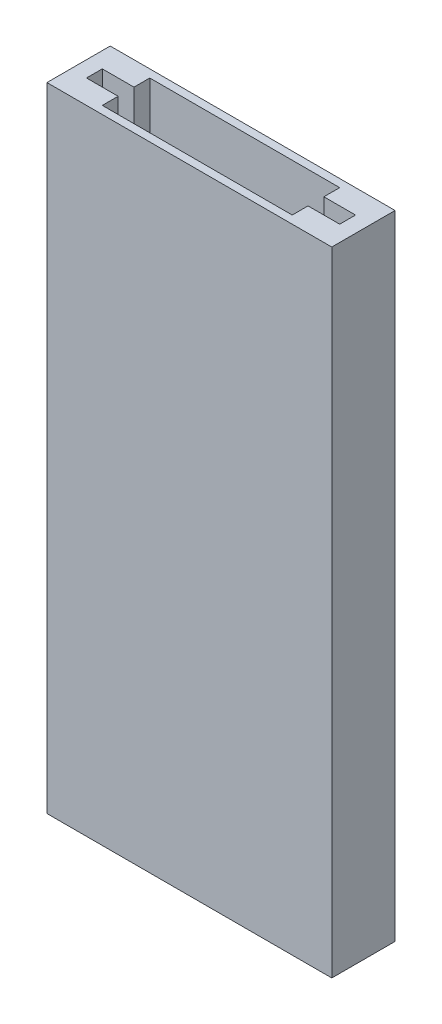
ISO-10303-21;
HEADER;
FILE_DESCRIPTION(('STEP AP214'),'2;1');
FILE_NAME('part.step','',(''),(''),'','','');
FILE_SCHEMA(('AUTOMOTIVE_DESIGN { 1 0 10303 214 1 1 1 1 }'));
ENDSEC;
DATA;
#1=APPLICATION_CONTEXT('core data for automotive mechanical design processes');
#2=APPLICATION_PROTOCOL_DEFINITION('international standard','automotive_design',2000,#1);
#3=PRODUCT_CONTEXT('',#1,'mechanical');
#4=PRODUCT('Part','Part','',(#3));
#5=PRODUCT_RELATED_PRODUCT_CATEGORY('part','',(#4));
#6=PRODUCT_DEFINITION_FORMATION('','',#4);
#7=PRODUCT_DEFINITION_CONTEXT('part definition',#1,'design');
#8=PRODUCT_DEFINITION('design','',#6,#7);
#9=PRODUCT_DEFINITION_SHAPE('','',#8);
#10=(LENGTH_UNIT() NAMED_UNIT(*) SI_UNIT(.MILLI.,.METRE.));
#11=(NAMED_UNIT(*) PLANE_ANGLE_UNIT() SI_UNIT($,.RADIAN.));
#12=(NAMED_UNIT(*) SI_UNIT($,.STERADIAN.) SOLID_ANGLE_UNIT());
#13=UNCERTAINTY_MEASURE_WITH_UNIT(LENGTH_MEASURE(1.E-05),#10,'distance_accuracy_value','');
#14=(GEOMETRIC_REPRESENTATION_CONTEXT(3) GLOBAL_UNCERTAINTY_ASSIGNED_CONTEXT((#13)) GLOBAL_UNIT_ASSIGNED_CONTEXT((#10,
#11,#12)) REPRESENTATION_CONTEXT('',''));
#15=CARTESIAN_POINT('',(0.,0.,0.));
#16=DIRECTION('',(0.,0.,1.));
#17=DIRECTION('',(1.,0.,0.));
#18=AXIS2_PLACEMENT_3D('',#15,#16,#17);
#19=CARTESIAN_POINT('',(28.575,63.5,6.35));
#20=DIRECTION('',(-1.,0.,0.));
#21=DIRECTION('',(0.,-1.,0.));
#22=AXIS2_PLACEMENT_3D('',#19,#20,#21);
#23=PLANE('',#22);
#24=DIRECTION('',(0.,1.,0.));
#25=VECTOR('',#24,1.);
#26=CARTESIAN_POINT('',(28.575,63.5,-6.35));
#27=LINE('',#26,#25);
#28=CARTESIAN_POINT('',(28.575,-63.5,-6.35));
#29=VERTEX_POINT('',#28);
#30=CARTESIAN_POINT('',(28.575,63.5,-6.35));
#31=VERTEX_POINT('',#30);
#32=EDGE_CURVE('E227',#29,#31,#27,.T.);
#33=ORIENTED_EDGE('',*,*,#32,.T.);
#34=DIRECTION('',(0.,0.,-1.));
#35=VECTOR('',#34,1.);
#36=CARTESIAN_POINT('',(28.575,63.5,6.35));
#37=LINE('',#36,#35);
#38=CARTESIAN_POINT('',(28.575,63.5,6.35));
#39=VERTEX_POINT('',#38);
#40=EDGE_CURVE('E261',#39,#31,#37,.T.);
#41=ORIENTED_EDGE('',*,*,#40,.F.);
#42=DIRECTION('',(0.,1.,0.));
#43=VECTOR('',#42,1.);
#44=CARTESIAN_POINT('',(28.575,63.5,6.35));
#45=LINE('',#44,#43);
#46=CARTESIAN_POINT('',(28.575,-63.5,6.35));
#47=VERTEX_POINT('',#46);
#48=EDGE_CURVE('E235',#47,#39,#45,.T.);
#49=ORIENTED_EDGE('',*,*,#48,.F.);
#50=DIRECTION('',(0.,0.,-1.));
#51=VECTOR('',#50,1.);
#52=CARTESIAN_POINT('',(28.575,-63.5,6.35));
#53=LINE('',#52,#51);
#54=EDGE_CURVE('E245',#47,#29,#53,.T.);
#55=ORIENTED_EDGE('',*,*,#54,.T.);
#56=EDGE_LOOP('',(#33,#41,#49,#55));
#57=FACE_BOUND('',#56,.T.);
#58=ADVANCED_FACE('F33',(#57),#23,.F.);
#59=CARTESIAN_POINT('',(-28.575,63.5,6.35));
#60=DIRECTION('',(0.,-1.,0.));
#61=DIRECTION('',(0.,0.,-1.));
#62=AXIS2_PLACEMENT_3D('',#59,#60,#61);
#63=PLANE('',#62);
#64=DIRECTION('',(-1.,0.,0.));
#65=VECTOR('',#64,1.);
#66=CARTESIAN_POINT('',(19.05,63.5,-4.7625));
#67=LINE('',#66,#65);
#68=CARTESIAN_POINT('',(19.05,63.5,-4.7625));
#69=VERTEX_POINT('',#68);
#70=CARTESIAN_POINT('',(-19.05,63.5,-4.7625));
#71=VERTEX_POINT('',#70);
#72=EDGE_CURVE('E163',#69,#71,#67,.T.);
#73=ORIENTED_EDGE('',*,*,#72,.F.);
#74=DIRECTION('',(0.,0.,1.));
#75=VECTOR('',#74,1.);
#76=CARTESIAN_POINT('',(19.05,63.5,-4.7625));
#77=LINE('',#76,#75);
#78=CARTESIAN_POINT('',(19.05,63.5,-1.5875));
#79=VERTEX_POINT('',#78);
#80=EDGE_CURVE('E144',#69,#79,#77,.T.);
#81=ORIENTED_EDGE('',*,*,#80,.T.);
#82=DIRECTION('',(-1.,0.,0.));
#83=VECTOR('',#82,1.);
#84=CARTESIAN_POINT('',(25.4,63.5,-1.5875));
#85=LINE('',#84,#83);
#86=CARTESIAN_POINT('',(25.4,63.5,-1.5875));
#87=VERTEX_POINT('',#86);
#88=EDGE_CURVE('E205',#87,#79,#85,.T.);
#89=ORIENTED_EDGE('',*,*,#88,.F.);
#90=DIRECTION('',(0.,0.,1.));
#91=VECTOR('',#90,1.);
#92=CARTESIAN_POINT('',(25.4,63.5,-1.5875));
#93=LINE('',#92,#91);
#94=CARTESIAN_POINT('',(25.4,63.5,1.5875));
#95=VERTEX_POINT('',#94);
#96=EDGE_CURVE('E213',#87,#95,#93,.T.);
#97=ORIENTED_EDGE('',*,*,#96,.T.);
#98=DIRECTION('',(-1.,0.,0.));
#99=VECTOR('',#98,1.);
#100=CARTESIAN_POINT('',(25.4,63.5,1.5875));
#101=LINE('',#100,#99);
#102=CARTESIAN_POINT('',(19.05,63.5,1.5875));
#103=VERTEX_POINT('',#102);
#104=EDGE_CURVE('E217',#95,#103,#101,.T.);
#105=ORIENTED_EDGE('',*,*,#104,.T.);
#106=CARTESIAN_POINT('',(19.05,63.5,4.7625));
#107=VERTEX_POINT('',#106);
#108=EDGE_CURVE('E157',#103,#107,#77,.T.);
#109=ORIENTED_EDGE('',*,*,#108,.T.);
#110=DIRECTION('',(-1.,0.,0.));
#111=VECTOR('',#110,1.);
#112=CARTESIAN_POINT('',(19.05,63.5,4.7625));
#113=LINE('',#112,#111);
#114=CARTESIAN_POINT('',(-19.05,63.5,4.7625));
#115=VERTEX_POINT('',#114);
#116=EDGE_CURVE('E179',#107,#115,#113,.T.);
#117=ORIENTED_EDGE('',*,*,#116,.T.);
#118=DIRECTION('',(0.,0.,1.));
#119=VECTOR('',#118,1.);
#120=CARTESIAN_POINT('',(-19.05,63.5,-4.7625));
#121=LINE('',#120,#119);
#122=CARTESIAN_POINT('',(-19.05,63.5,1.5875));
#123=VERTEX_POINT('',#122);
#124=EDGE_CURVE('E156',#123,#115,#121,.T.);
#125=ORIENTED_EDGE('',*,*,#124,.F.);
#126=CARTESIAN_POINT('',(-25.4,63.5,1.5875));
#127=VERTEX_POINT('',#126);
#128=EDGE_CURVE('E216',#123,#127,#101,.T.);
#129=ORIENTED_EDGE('',*,*,#128,.T.);
#130=DIRECTION('',(0.,0.,1.));
#131=VECTOR('',#130,1.);
#132=CARTESIAN_POINT('',(-25.4,63.5,-1.5875));
#133=LINE('',#132,#131);
#134=CARTESIAN_POINT('',(-25.4,63.5,-1.5875));
#135=VERTEX_POINT('',#134);
#136=EDGE_CURVE('E230',#135,#127,#133,.T.);
#137=ORIENTED_EDGE('',*,*,#136,.F.);
#138=CARTESIAN_POINT('',(-19.05,63.5,-1.5875));
#139=VERTEX_POINT('',#138);
#140=EDGE_CURVE('E203',#139,#135,#85,.T.);
#141=ORIENTED_EDGE('',*,*,#140,.F.);
#142=EDGE_CURVE('E47',#71,#139,#121,.T.);
#143=ORIENTED_EDGE('',*,*,#142,.F.);
#144=EDGE_LOOP('',(#73,#81,#89,#97,#105,#109,#117,#125,#129,#137,#141,#143));
#145=FACE_BOUND('',#144,.T.);
#146=DIRECTION('',(-1.,0.,0.));
#147=VECTOR('',#146,1.);
#148=CARTESIAN_POINT('',(-28.575,63.5,-6.35));
#149=LINE('',#148,#147);
#150=CARTESIAN_POINT('',(-28.575,63.5,-6.35));
#151=VERTEX_POINT('',#150);
#152=EDGE_CURVE('E248',#31,#151,#149,.T.);
#153=ORIENTED_EDGE('',*,*,#152,.T.);
#154=DIRECTION('',(0.,0.,-1.));
#155=VECTOR('',#154,1.);
#156=CARTESIAN_POINT('',(-28.575,63.5,6.35));
#157=LINE('',#156,#155);
#158=CARTESIAN_POINT('',(-28.575,63.5,6.35));
#159=VERTEX_POINT('',#158);
#160=EDGE_CURVE('E258',#159,#151,#157,.T.);
#161=ORIENTED_EDGE('',*,*,#160,.F.);
#162=DIRECTION('',(-1.,0.,0.));
#163=VECTOR('',#162,1.);
#164=CARTESIAN_POINT('',(-28.575,63.5,6.35));
#165=LINE('',#164,#163);
#166=EDGE_CURVE('E238',#39,#159,#165,.T.);
#167=ORIENTED_EDGE('',*,*,#166,.F.);
#168=ORIENTED_EDGE('',*,*,#40,.T.);
#169=EDGE_LOOP('',(#153,#161,#167,#168));
#170=FACE_BOUND('',#169,.T.);
#171=ADVANCED_FACE('F168',(#145,#170),#63,.F.);
#172=CARTESIAN_POINT('',(-28.575,63.5,6.35));
#173=DIRECTION('',(1.,0.,0.));
#174=DIRECTION('',(0.,1.,0.));
#175=AXIS2_PLACEMENT_3D('',#172,#173,#174);
#176=PLANE('',#175);
#177=DIRECTION('',(0.,-1.,0.));
#178=VECTOR('',#177,1.);
#179=CARTESIAN_POINT('',(-28.575,63.5,-6.35));
#180=LINE('',#179,#178);
#181=CARTESIAN_POINT('',(-28.575,-63.5,-6.35));
#182=VERTEX_POINT('',#181);
#183=EDGE_CURVE('E250',#151,#182,#180,.T.);
#184=ORIENTED_EDGE('',*,*,#183,.T.);
#185=DIRECTION('',(0.,0.,-1.));
#186=VECTOR('',#185,1.);
#187=CARTESIAN_POINT('',(-28.575,-63.5,6.35));
#188=LINE('',#187,#186);
#189=CARTESIAN_POINT('',(-28.575,-63.5,6.35));
#190=VERTEX_POINT('',#189);
#191=EDGE_CURVE('E255',#190,#182,#188,.T.);
#192=ORIENTED_EDGE('',*,*,#191,.F.);
#193=DIRECTION('',(0.,-1.,0.));
#194=VECTOR('',#193,1.);
#195=CARTESIAN_POINT('',(-28.575,63.5,6.35));
#196=LINE('',#195,#194);
#197=EDGE_CURVE('E241',#159,#190,#196,.T.);
#198=ORIENTED_EDGE('',*,*,#197,.F.);
#199=ORIENTED_EDGE('',*,*,#160,.T.);
#200=EDGE_LOOP('',(#184,#192,#198,#199));
#201=FACE_BOUND('',#200,.T.);
#202=ADVANCED_FACE('F317',(#201),#176,.F.);
#203=CARTESIAN_POINT('',(-28.575,-63.5,6.35));
#204=DIRECTION('',(0.,1.,0.));
#205=DIRECTION('',(0.,0.,1.));
#206=AXIS2_PLACEMENT_3D('',#203,#204,#205);
#207=PLANE('',#206);
#208=DIRECTION('',(1.,0.,0.));
#209=VECTOR('',#208,1.);
#210=CARTESIAN_POINT('',(-28.575,-63.5,-6.35));
#211=LINE('',#210,#209);
#212=EDGE_CURVE('E239',#182,#29,#211,.T.);
#213=ORIENTED_EDGE('',*,*,#212,.T.);
#214=ORIENTED_EDGE('',*,*,#54,.F.);
#215=DIRECTION('',(1.,0.,0.));
#216=VECTOR('',#215,1.);
#217=CARTESIAN_POINT('',(-28.575,-63.5,6.35));
#218=LINE('',#217,#216);
#219=EDGE_CURVE('E243',#190,#47,#218,.T.);
#220=ORIENTED_EDGE('',*,*,#219,.F.);
#221=ORIENTED_EDGE('',*,*,#191,.T.);
#222=EDGE_LOOP('',(#213,#214,#220,#221));
#223=FACE_BOUND('',#222,.T.);
#224=ADVANCED_FACE('F333',(#223),#207,.F.);
#225=CARTESIAN_POINT('',(0.,0.,6.35));
#226=DIRECTION('',(0.,0.,1.));
#227=DIRECTION('',(1.,0.,0.));
#228=AXIS2_PLACEMENT_3D('',#225,#226,#227);
#229=PLANE('',#228);
#230=ORIENTED_EDGE('',*,*,#48,.T.);
#231=ORIENTED_EDGE('',*,*,#166,.T.);
#232=ORIENTED_EDGE('',*,*,#197,.T.);
#233=ORIENTED_EDGE('',*,*,#219,.T.);
#234=EDGE_LOOP('',(#230,#231,#232,#233));
#235=FACE_BOUND('',#234,.T.);
#236=ADVANCED_FACE('F329',(#235),#229,.T.);
#237=CARTESIAN_POINT('',(0.,0.,-6.35));
#238=DIRECTION('',(0.,0.,1.));
#239=DIRECTION('',(1.,0.,0.));
#240=AXIS2_PLACEMENT_3D('',#237,#238,#239);
#241=PLANE('',#240);
#242=ORIENTED_EDGE('',*,*,#32,.F.);
#243=ORIENTED_EDGE('',*,*,#212,.F.);
#244=ORIENTED_EDGE('',*,*,#183,.F.);
#245=ORIENTED_EDGE('',*,*,#152,.F.);
#246=EDGE_LOOP('',(#242,#243,#244,#245));
#247=FACE_BOUND('',#246,.T.);
#248=ADVANCED_FACE('F324',(#247),#241,.F.);
#249=CARTESIAN_POINT('',(25.4,63.5,-1.5875));
#250=DIRECTION('',(1.,0.,0.));
#251=DIRECTION('',(0.,1.,0.));
#252=AXIS2_PLACEMENT_3D('',#249,#250,#251);
#253=PLANE('',#252);
#254=DIRECTION('',(0.,1.,0.));
#255=VECTOR('',#254,1.);
#256=CARTESIAN_POINT('',(25.4,63.5,1.5875));
#257=LINE('',#256,#255);
#258=CARTESIAN_POINT('',(25.4,-57.15,1.5875));
#259=VERTEX_POINT('',#258);
#260=EDGE_CURVE('E199',#259,#95,#257,.T.);
#261=ORIENTED_EDGE('',*,*,#260,.T.);
#262=ORIENTED_EDGE('',*,*,#96,.F.);
#263=DIRECTION('',(0.,1.,0.));
#264=VECTOR('',#263,1.);
#265=CARTESIAN_POINT('',(25.4,63.5,-1.5875));
#266=LINE('',#265,#264);
#267=CARTESIAN_POINT('',(25.4,-57.15,-1.5875));
#268=VERTEX_POINT('',#267);
#269=EDGE_CURVE('E200',#268,#87,#266,.T.);
#270=ORIENTED_EDGE('',*,*,#269,.F.);
#271=DIRECTION('',(0.,0.,1.));
#272=VECTOR('',#271,1.);
#273=CARTESIAN_POINT('',(25.4,-57.15,-1.5875));
#274=LINE('',#273,#272);
#275=EDGE_CURVE('E225',#268,#259,#274,.T.);
#276=ORIENTED_EDGE('',*,*,#275,.T.);
#277=EDGE_LOOP('',(#261,#262,#270,#276));
#278=FACE_BOUND('',#277,.T.);
#279=ADVANCED_FACE('F289',(#278),#253,.F.);
#280=CARTESIAN_POINT('',(25.4,-57.15,-1.5875));
#281=DIRECTION('',(0.,-1.,0.));
#282=DIRECTION('',(0.,0.,-1.));
#283=AXIS2_PLACEMENT_3D('',#280,#281,#282);
#284=PLANE('',#283);
#285=DIRECTION('',(1.,0.,0.));
#286=VECTOR('',#285,1.);
#287=CARTESIAN_POINT('',(25.4,-57.15,1.5875));
#288=LINE('',#287,#286);
#289=CARTESIAN_POINT('',(-25.4,-57.15,1.5875));
#290=VERTEX_POINT('',#289);
#291=EDGE_CURVE('E204',#290,#259,#288,.T.);
#292=ORIENTED_EDGE('',*,*,#291,.T.);
#293=ORIENTED_EDGE('',*,*,#275,.F.);
#294=DIRECTION('',(1.,0.,0.));
#295=VECTOR('',#294,1.);
#296=CARTESIAN_POINT('',(25.4,-57.15,-1.5875));
#297=LINE('',#296,#295);
#298=CARTESIAN_POINT('',(-25.4,-57.15,-1.5875));
#299=VERTEX_POINT('',#298);
#300=EDGE_CURVE('E210',#299,#268,#297,.T.);
#301=ORIENTED_EDGE('',*,*,#300,.F.);
#302=DIRECTION('',(0.,0.,1.));
#303=VECTOR('',#302,1.);
#304=CARTESIAN_POINT('',(-25.4,-57.15,-1.5875));
#305=LINE('',#304,#303);
#306=EDGE_CURVE('E228',#299,#290,#305,.T.);
#307=ORIENTED_EDGE('',*,*,#306,.T.);
#308=EDGE_LOOP('',(#292,#293,#301,#307));
#309=FACE_BOUND('',#308,.T.);
#310=ADVANCED_FACE('F295',(#309),#284,.F.);
#311=CARTESIAN_POINT('',(-25.4,63.5,-1.5875));
#312=DIRECTION('',(-1.,0.,0.));
#313=DIRECTION('',(0.,-1.,0.));
#314=AXIS2_PLACEMENT_3D('',#311,#312,#313);
#315=PLANE('',#314);
#316=DIRECTION('',(0.,-1.,0.));
#317=VECTOR('',#316,1.);
#318=CARTESIAN_POINT('',(-25.4,63.5,1.5875));
#319=LINE('',#318,#317);
#320=EDGE_CURVE('E220',#127,#290,#319,.T.);
#321=ORIENTED_EDGE('',*,*,#320,.T.);
#322=ORIENTED_EDGE('',*,*,#306,.F.);
#323=DIRECTION('',(0.,-1.,0.));
#324=VECTOR('',#323,1.);
#325=CARTESIAN_POINT('',(-25.4,63.5,-1.5875));
#326=LINE('',#325,#324);
#327=EDGE_CURVE('E207',#135,#299,#326,.T.);
#328=ORIENTED_EDGE('',*,*,#327,.F.);
#329=ORIENTED_EDGE('',*,*,#136,.T.);
#330=EDGE_LOOP('',(#321,#322,#328,#329));
#331=FACE_BOUND('',#330,.T.);
#332=ADVANCED_FACE('F298',(#331),#315,.F.);
#333=CARTESIAN_POINT('',(0.,0.,-1.5875));
#334=DIRECTION('',(0.,0.,-1.));
#335=DIRECTION('',(-1.,0.,0.));
#336=AXIS2_PLACEMENT_3D('',#333,#334,#335);
#337=PLANE('',#336);
#338=ORIENTED_EDGE('',*,*,#88,.T.);
#339=DIRECTION('',(0.,-1.,0.));
#340=VECTOR('',#339,1.);
#341=CARTESIAN_POINT('',(19.05,0.,-1.5875));
#342=LINE('',#341,#340);
#343=CARTESIAN_POINT('',(19.05,19.05,-1.5875));
#344=VERTEX_POINT('',#343);
#345=EDGE_CURVE('E151',#79,#344,#342,.T.);
#346=ORIENTED_EDGE('',*,*,#345,.T.);
#347=DIRECTION('',(-1.,0.,0.));
#348=VECTOR('',#347,1.);
#349=CARTESIAN_POINT('',(0.,19.05,-1.5875));
#350=LINE('',#349,#348);
#351=CARTESIAN_POINT('',(-19.05,19.05,-1.5875));
#352=VERTEX_POINT('',#351);
#353=EDGE_CURVE('E195',#344,#352,#350,.T.);
#354=ORIENTED_EDGE('',*,*,#353,.T.);
#355=DIRECTION('',(0.,1.,0.));
#356=VECTOR('',#355,1.);
#357=CARTESIAN_POINT('',(-19.05,0.,-1.5875));
#358=LINE('',#357,#356);
#359=EDGE_CURVE('E188',#352,#139,#358,.T.);
#360=ORIENTED_EDGE('',*,*,#359,.T.);
#361=ORIENTED_EDGE('',*,*,#140,.T.);
#362=ORIENTED_EDGE('',*,*,#327,.T.);
#363=ORIENTED_EDGE('',*,*,#300,.T.);
#364=ORIENTED_EDGE('',*,*,#269,.T.);
#365=EDGE_LOOP('',(#338,#346,#354,#360,#361,#362,#363,#364));
#366=FACE_BOUND('',#365,.T.);
#367=ADVANCED_FACE('F291',(#366),#337,.F.);
#368=CARTESIAN_POINT('',(0.,0.,1.5875));
#369=DIRECTION('',(0.,0.,-1.));
#370=DIRECTION('',(-1.,0.,0.));
#371=AXIS2_PLACEMENT_3D('',#368,#369,#370);
#372=PLANE('',#371);
#373=DIRECTION('',(0.,-1.,0.));
#374=VECTOR('',#373,1.);
#375=CARTESIAN_POINT('',(19.05,0.,1.5875));
#376=LINE('',#375,#374);
#377=CARTESIAN_POINT('',(19.05,19.05,1.5875));
#378=VERTEX_POINT('',#377);
#379=EDGE_CURVE('E11',#103,#378,#376,.T.);
#380=ORIENTED_EDGE('',*,*,#379,.F.);
#381=ORIENTED_EDGE('',*,*,#104,.F.);
#382=ORIENTED_EDGE('',*,*,#260,.F.);
#383=ORIENTED_EDGE('',*,*,#291,.F.);
#384=ORIENTED_EDGE('',*,*,#320,.F.);
#385=ORIENTED_EDGE('',*,*,#128,.F.);
#386=DIRECTION('',(0.,1.,0.));
#387=VECTOR('',#386,1.);
#388=CARTESIAN_POINT('',(-19.05,0.,1.5875));
#389=LINE('',#388,#387);
#390=CARTESIAN_POINT('',(-19.05,19.05,1.5875));
#391=VERTEX_POINT('',#390);
#392=EDGE_CURVE('E264',#391,#123,#389,.T.);
#393=ORIENTED_EDGE('',*,*,#392,.F.);
#394=DIRECTION('',(-1.,0.,0.));
#395=VECTOR('',#394,1.);
#396=CARTESIAN_POINT('',(0.,19.05,1.5875));
#397=LINE('',#396,#395);
#398=EDGE_CURVE('E40',#378,#391,#397,.T.);
#399=ORIENTED_EDGE('',*,*,#398,.F.);
#400=EDGE_LOOP('',(#380,#381,#382,#383,#384,#385,#393,#399));
#401=FACE_BOUND('',#400,.T.);
#402=ADVANCED_FACE('F273',(#401),#372,.T.);
#403=CARTESIAN_POINT('',(-19.05,63.5,-4.7625));
#404=DIRECTION('',(-1.,0.,0.));
#405=DIRECTION('',(0.,-1.,0.));
#406=AXIS2_PLACEMENT_3D('',#403,#404,#405);
#407=PLANE('',#406);
#408=ORIENTED_EDGE('',*,*,#392,.T.);
#409=ORIENTED_EDGE('',*,*,#124,.T.);
#410=DIRECTION('',(0.,-1.,0.));
#411=VECTOR('',#410,1.);
#412=CARTESIAN_POINT('',(-19.05,63.5,4.7625));
#413=LINE('',#412,#411);
#414=CARTESIAN_POINT('',(-19.05,19.05,4.7625));
#415=VERTEX_POINT('',#414);
#416=EDGE_CURVE('E182',#115,#415,#413,.T.);
#417=ORIENTED_EDGE('',*,*,#416,.T.);
#418=DIRECTION('',(0.,0.,1.));
#419=VECTOR('',#418,1.);
#420=CARTESIAN_POINT('',(-19.05,19.05,-4.7625));
#421=LINE('',#420,#419);
#422=EDGE_CURVE('E55',#391,#415,#421,.T.);
#423=ORIENTED_EDGE('',*,*,#422,.F.);
#424=EDGE_LOOP('',(#408,#409,#417,#423));
#425=FACE_BOUND('',#424,.T.);
#426=ADVANCED_FACE('F276',(#425),#407,.F.);
#427=CARTESIAN_POINT('',(19.05,19.05,-4.7625));
#428=DIRECTION('',(0.,-1.,0.));
#429=DIRECTION('',(0.,0.,-1.));
#430=AXIS2_PLACEMENT_3D('',#427,#428,#429);
#431=PLANE('',#430);
#432=ORIENTED_EDGE('',*,*,#398,.T.);
#433=ORIENTED_EDGE('',*,*,#422,.T.);
#434=DIRECTION('',(1.,0.,0.));
#435=VECTOR('',#434,1.);
#436=CARTESIAN_POINT('',(19.05,19.05,4.7625));
#437=LINE('',#436,#435);
#438=CARTESIAN_POINT('',(19.05,19.05,4.7625));
#439=VERTEX_POINT('',#438);
#440=EDGE_CURVE('E166',#415,#439,#437,.T.);
#441=ORIENTED_EDGE('',*,*,#440,.T.);
#442=DIRECTION('',(0.,0.,1.));
#443=VECTOR('',#442,1.);
#444=CARTESIAN_POINT('',(19.05,19.05,-4.7625));
#445=LINE('',#444,#443);
#446=EDGE_CURVE('E189',#378,#439,#445,.T.);
#447=ORIENTED_EDGE('',*,*,#446,.F.);
#448=EDGE_LOOP('',(#432,#433,#441,#447));
#449=FACE_BOUND('',#448,.T.);
#450=ADVANCED_FACE('F269',(#449),#431,.F.);
#451=CARTESIAN_POINT('',(19.05,63.5,-4.7625));
#452=DIRECTION('',(1.,0.,0.));
#453=DIRECTION('',(0.,1.,0.));
#454=AXIS2_PLACEMENT_3D('',#451,#452,#453);
#455=PLANE('',#454);
#456=ORIENTED_EDGE('',*,*,#379,.T.);
#457=ORIENTED_EDGE('',*,*,#446,.T.);
#458=DIRECTION('',(0.,1.,0.));
#459=VECTOR('',#458,1.);
#460=CARTESIAN_POINT('',(19.05,63.5,4.7625));
#461=LINE('',#460,#459);
#462=EDGE_CURVE('E176',#439,#107,#461,.T.);
#463=ORIENTED_EDGE('',*,*,#462,.T.);
#464=ORIENTED_EDGE('',*,*,#108,.F.);
#465=EDGE_LOOP('',(#456,#457,#463,#464));
#466=FACE_BOUND('',#465,.T.);
#467=ADVANCED_FACE('F285',(#466),#455,.F.);
#468=CARTESIAN_POINT('',(0.,0.,4.7625));
#469=DIRECTION('',(0.,0.,-1.));
#470=DIRECTION('',(-1.,0.,0.));
#471=AXIS2_PLACEMENT_3D('',#468,#469,#470);
#472=PLANE('',#471);
#473=ORIENTED_EDGE('',*,*,#462,.F.);
#474=ORIENTED_EDGE('',*,*,#440,.F.);
#475=ORIENTED_EDGE('',*,*,#416,.F.);
#476=ORIENTED_EDGE('',*,*,#116,.F.);
#477=EDGE_LOOP('',(#473,#474,#475,#476));
#478=FACE_BOUND('',#477,.T.);
#479=ADVANCED_FACE('F282',(#478),#472,.T.);
#480=ORIENTED_EDGE('',*,*,#80,.F.);
#481=DIRECTION('',(0.,1.,0.));
#482=VECTOR('',#481,1.);
#483=CARTESIAN_POINT('',(19.05,63.5,-4.7625));
#484=LINE('',#483,#482);
#485=CARTESIAN_POINT('',(19.05,19.05,-4.7625));
#486=VERTEX_POINT('',#485);
#487=EDGE_CURVE('E148',#486,#69,#484,.T.);
#488=ORIENTED_EDGE('',*,*,#487,.F.);
#489=EDGE_CURVE('E186',#486,#344,#445,.T.);
#490=ORIENTED_EDGE('',*,*,#489,.T.);
#491=ORIENTED_EDGE('',*,*,#345,.F.);
#492=EDGE_LOOP('',(#480,#488,#490,#491));
#493=FACE_BOUND('',#492,.T.);
#494=ADVANCED_FACE('F146',(#493),#455,.F.);
#495=ORIENTED_EDGE('',*,*,#489,.F.);
#496=DIRECTION('',(1.,0.,0.));
#497=VECTOR('',#496,1.);
#498=CARTESIAN_POINT('',(19.05,19.05,-4.7625));
#499=LINE('',#498,#497);
#500=CARTESIAN_POINT('',(-19.05,19.05,-4.7625));
#501=VERTEX_POINT('',#500);
#502=EDGE_CURVE('E165',#501,#486,#499,.T.);
#503=ORIENTED_EDGE('',*,*,#502,.F.);
#504=EDGE_CURVE('E190',#501,#352,#421,.T.);
#505=ORIENTED_EDGE('',*,*,#504,.T.);
#506=ORIENTED_EDGE('',*,*,#353,.F.);
#507=EDGE_LOOP('',(#495,#503,#505,#506));
#508=FACE_BOUND('',#507,.T.);
#509=ADVANCED_FACE('F301',(#508),#431,.F.);
#510=ORIENTED_EDGE('',*,*,#504,.F.);
#511=DIRECTION('',(0.,-1.,0.));
#512=VECTOR('',#511,1.);
#513=CARTESIAN_POINT('',(-19.05,63.5,-4.7625));
#514=LINE('',#513,#512);
#515=EDGE_CURVE('E171',#71,#501,#514,.T.);
#516=ORIENTED_EDGE('',*,*,#515,.F.);
#517=ORIENTED_EDGE('',*,*,#142,.T.);
#518=ORIENTED_EDGE('',*,*,#359,.F.);
#519=EDGE_LOOP('',(#510,#516,#517,#518));
#520=FACE_BOUND('',#519,.T.);
#521=ADVANCED_FACE('F299',(#520),#407,.F.);
#522=CARTESIAN_POINT('',(0.,0.,-4.7625));
#523=DIRECTION('',(0.,0.,-1.));
#524=DIRECTION('',(-1.,0.,0.));
#525=AXIS2_PLACEMENT_3D('',#522,#523,#524);
#526=PLANE('',#525);
#527=ORIENTED_EDGE('',*,*,#487,.T.);
#528=ORIENTED_EDGE('',*,*,#72,.T.);
#529=ORIENTED_EDGE('',*,*,#515,.T.);
#530=ORIENTED_EDGE('',*,*,#502,.T.);
#531=EDGE_LOOP('',(#527,#528,#529,#530));
#532=FACE_BOUND('',#531,.T.);
#533=ADVANCED_FACE('F161',(#532),#526,.F.);
#534=CLOSED_SHELL('',(#58,#171,#202,#224,#236,#248,#279,#310,#332,#367,#402,#426,#450,#467,#479,
#494,#509,#521,#533));
#535=MANIFOLD_SOLID_BREP('B2',#534);
#536=ADVANCED_BREP_SHAPE_REPRESENTATION('',(#18,#535),#14);
#537=SHAPE_DEFINITION_REPRESENTATION(#9,#536);
ENDSEC;
END-ISO-10303-21;
